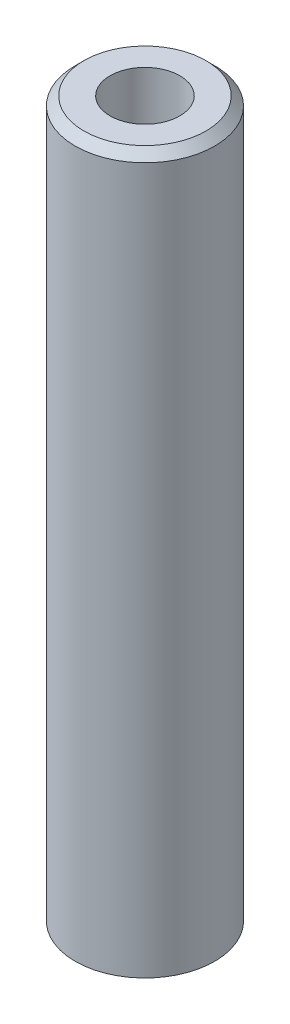
ISO-10303-21;
HEADER;
FILE_DESCRIPTION(('STEP AP214'),'2;1');
FILE_NAME('part.step','',(''),(''),'','','');
FILE_SCHEMA(('AUTOMOTIVE_DESIGN { 1 0 10303 214 1 1 1 1 }'));
ENDSEC;
DATA;
#1=APPLICATION_CONTEXT('core data for automotive mechanical design processes');
#2=APPLICATION_PROTOCOL_DEFINITION('international standard','automotive_design',2000,#1);
#3=PRODUCT_CONTEXT('',#1,'mechanical');
#4=PRODUCT('Part','Part','',(#3));
#5=PRODUCT_RELATED_PRODUCT_CATEGORY('part','',(#4));
#6=PRODUCT_DEFINITION_FORMATION('','',#4);
#7=PRODUCT_DEFINITION_CONTEXT('part definition',#1,'design');
#8=PRODUCT_DEFINITION('design','',#6,#7);
#9=PRODUCT_DEFINITION_SHAPE('','',#8);
#10=(LENGTH_UNIT() NAMED_UNIT(*) SI_UNIT(.MILLI.,.METRE.));
#11=(NAMED_UNIT(*) PLANE_ANGLE_UNIT() SI_UNIT($,.RADIAN.));
#12=(NAMED_UNIT(*) SI_UNIT($,.STERADIAN.) SOLID_ANGLE_UNIT());
#13=UNCERTAINTY_MEASURE_WITH_UNIT(LENGTH_MEASURE(1.E-05),#10,'distance_accuracy_value','');
#14=(GEOMETRIC_REPRESENTATION_CONTEXT(3) GLOBAL_UNCERTAINTY_ASSIGNED_CONTEXT((#13)) GLOBAL_UNIT_ASSIGNED_CONTEXT((#10,
#11,#12)) REPRESENTATION_CONTEXT('',''));
#15=CARTESIAN_POINT('',(0.,0.,0.));
#16=DIRECTION('',(0.,0.,1.));
#17=DIRECTION('',(1.,0.,0.));
#18=AXIS2_PLACEMENT_3D('',#15,#16,#17);
#19=CARTESIAN_POINT('',(0.,41.,0.));
#20=DIRECTION('',(0.,1.,0.));
#21=DIRECTION('',(0.,0.,1.));
#22=AXIS2_PLACEMENT_3D('',#19,#20,#21);
#23=PLANE('',#22);
#24=CARTESIAN_POINT('',(0.,41.,0.));
#25=DIRECTION('',(0.,1.,0.));
#26=DIRECTION('',(0.,0.,1.));
#27=AXIS2_PLACEMENT_3D('',#24,#25,#26);
#28=CIRCLE('',#27,3.50000000000001);
#29=CARTESIAN_POINT('',(0.,41.,3.50000000000001));
#30=VERTEX_POINT('',#29);
#31=EDGE_CURVE('E49',#30,#30,#28,.T.);
#32=ORIENTED_EDGE('',*,*,#31,.T.);
#33=EDGE_LOOP('',(#32));
#34=FACE_BOUND('',#33,.T.);
#35=CARTESIAN_POINT('',(0.,41.,0.));
#36=DIRECTION('',(0.,1.,0.));
#37=DIRECTION('',(0.,0.,1.));
#38=AXIS2_PLACEMENT_3D('',#35,#36,#37);
#39=CIRCLE('',#38,2.);
#40=CARTESIAN_POINT('',(0.,41.,2.));
#41=VERTEX_POINT('',#40);
#42=EDGE_CURVE('E57',#41,#41,#39,.T.);
#43=ORIENTED_EDGE('',*,*,#42,.F.);
#44=EDGE_LOOP('',(#43));
#45=FACE_BOUND('',#44,.T.);
#46=ADVANCED_FACE('F41',(#34,#45),#23,.T.);
#47=CARTESIAN_POINT('',(0.,0.,0.));
#48=DIRECTION('',(0.,1.,0.));
#49=DIRECTION('',(0.,0.,1.));
#50=AXIS2_PLACEMENT_3D('',#47,#48,#49);
#51=PLANE('',#50);
#52=CARTESIAN_POINT('',(0.,0.,0.));
#53=DIRECTION('',(0.,1.,0.));
#54=DIRECTION('',(0.,0.,1.));
#55=AXIS2_PLACEMENT_3D('',#52,#53,#54);
#56=CIRCLE('',#55,4.);
#57=CARTESIAN_POINT('',(0.,0.,4.));
#58=VERTEX_POINT('',#57);
#59=EDGE_CURVE('E53',#58,#58,#56,.T.);
#60=ORIENTED_EDGE('',*,*,#59,.F.);
#61=EDGE_LOOP('',(#60));
#62=FACE_BOUND('',#61,.T.);
#63=CARTESIAN_POINT('',(0.,0.,0.));
#64=DIRECTION('',(0.,1.,0.));
#65=DIRECTION('',(0.,0.,1.));
#66=AXIS2_PLACEMENT_3D('',#63,#64,#65);
#67=CIRCLE('',#66,2.);
#68=CARTESIAN_POINT('',(0.,0.,2.));
#69=VERTEX_POINT('',#68);
#70=EDGE_CURVE('E60',#69,#69,#67,.T.);
#71=ORIENTED_EDGE('',*,*,#70,.T.);
#72=EDGE_LOOP('',(#71));
#73=FACE_BOUND('',#72,.T.);
#74=ADVANCED_FACE('F70',(#62,#73),#51,.F.);
#75=CARTESIAN_POINT('',(0.,41.,0.));
#76=DIRECTION('',(0.,-1.,0.));
#77=DIRECTION('',(0.,0.,-1.));
#78=AXIS2_PLACEMENT_3D('',#75,#76,#77);
#79=CYLINDRICAL_SURFACE('',#78,4.);
#80=CARTESIAN_POINT('',(0.,40.5,0.));
#81=DIRECTION('',(0.,1.,0.));
#82=DIRECTION('',(0.,0.,1.));
#83=AXIS2_PLACEMENT_3D('',#80,#81,#82);
#84=CIRCLE('',#83,4.);
#85=CARTESIAN_POINT('',(0.,40.5,4.));
#86=VERTEX_POINT('',#85);
#87=EDGE_CURVE('E10',#86,#86,#84,.F.);
#88=ORIENTED_EDGE('',*,*,#87,.T.);
#89=EDGE_LOOP('',(#88));
#90=FACE_BOUND('',#89,.T.);
#91=ORIENTED_EDGE('',*,*,#59,.T.);
#92=EDGE_LOOP('',(#91));
#93=FACE_BOUND('',#92,.T.);
#94=ADVANCED_FACE('F77',(#90,#93),#79,.T.);
#95=CARTESIAN_POINT('',(0.,41.,0.));
#96=DIRECTION('',(0.,-1.,0.));
#97=DIRECTION('',(0.,0.,-1.));
#98=AXIS2_PLACEMENT_3D('',#95,#96,#97);
#99=CYLINDRICAL_SURFACE('',#98,2.);
#100=ORIENTED_EDGE('',*,*,#42,.T.);
#101=EDGE_LOOP('',(#100));
#102=FACE_BOUND('',#101,.T.);
#103=ORIENTED_EDGE('',*,*,#70,.F.);
#104=EDGE_LOOP('',(#103));
#105=FACE_BOUND('',#104,.T.);
#106=ADVANCED_FACE('F66',(#102,#105),#99,.F.);
#107=CARTESIAN_POINT('',(0.,41.,0.));
#108=DIRECTION('',(0.,-1.,0.));
#109=DIRECTION('',(0.,0.,-1.));
#110=AXIS2_PLACEMENT_3D('',#107,#108,#109);
#111=CONICAL_SURFACE('',#110,3.50000000000001,0.785398163397445);
#112=ORIENTED_EDGE('',*,*,#87,.F.);
#113=EDGE_LOOP('',(#112));
#114=FACE_BOUND('',#113,.T.);
#115=ORIENTED_EDGE('',*,*,#31,.F.);
#116=EDGE_LOOP('',(#115));
#117=FACE_BOUND('',#116,.T.);
#118=ADVANCED_FACE('F44',(#114,#117),#111,.T.);
#119=CLOSED_SHELL('',(#46,#74,#94,#106,#118));
#120=MANIFOLD_SOLID_BREP('B2',#119);
#121=ADVANCED_BREP_SHAPE_REPRESENTATION('',(#18,#120),#14);
#122=SHAPE_DEFINITION_REPRESENTATION(#9,#121);
ENDSEC;
END-ISO-10303-21;
